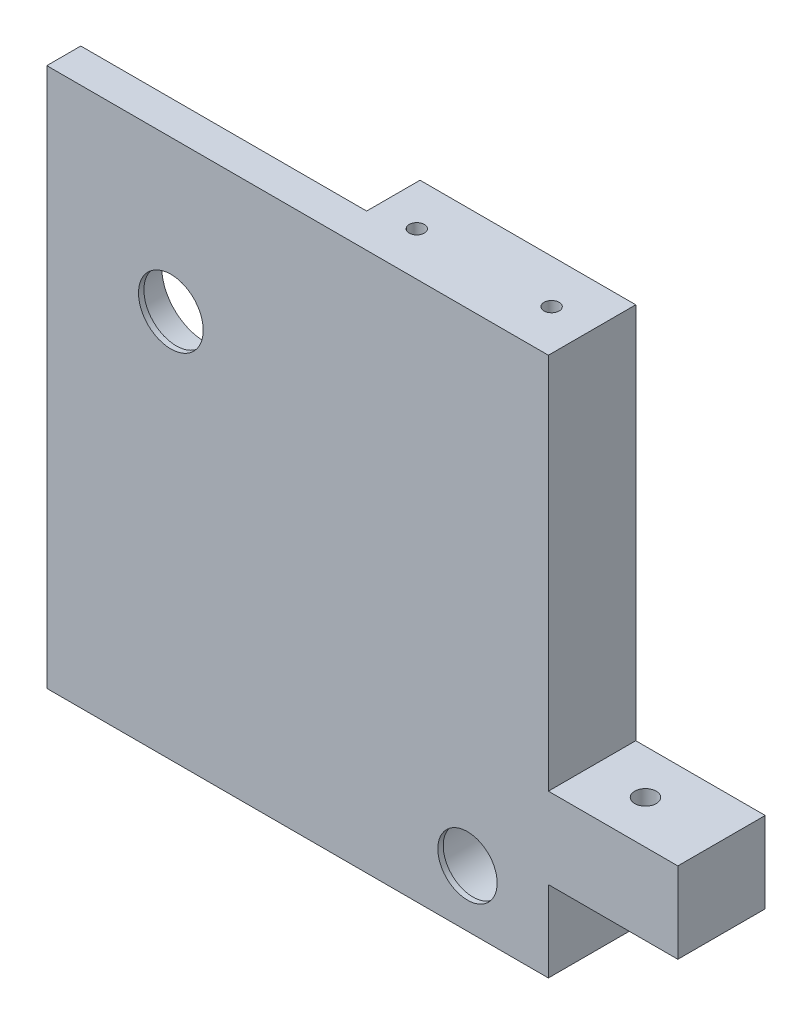
ISO-10303-21;
HEADER;
FILE_DESCRIPTION(('STEP AP214'),'2;1');
FILE_NAME('part.step','',(''),(''),'','','');
FILE_SCHEMA(('AUTOMOTIVE_DESIGN { 1 0 10303 214 1 1 1 1 }'));
ENDSEC;
DATA;
#1=APPLICATION_CONTEXT('core data for automotive mechanical design processes');
#2=APPLICATION_PROTOCOL_DEFINITION('international standard','automotive_design',2000,#1);
#3=PRODUCT_CONTEXT('',#1,'mechanical');
#4=PRODUCT('Part','Part','',(#3));
#5=PRODUCT_RELATED_PRODUCT_CATEGORY('part','',(#4));
#6=PRODUCT_DEFINITION_FORMATION('','',#4);
#7=PRODUCT_DEFINITION_CONTEXT('part definition',#1,'design');
#8=PRODUCT_DEFINITION('design','',#6,#7);
#9=PRODUCT_DEFINITION_SHAPE('','',#8);
#10=(LENGTH_UNIT() NAMED_UNIT(*) SI_UNIT(.MILLI.,.METRE.));
#11=(NAMED_UNIT(*) PLANE_ANGLE_UNIT() SI_UNIT($,.RADIAN.));
#12=(NAMED_UNIT(*) SI_UNIT($,.STERADIAN.) SOLID_ANGLE_UNIT());
#13=UNCERTAINTY_MEASURE_WITH_UNIT(LENGTH_MEASURE(1.E-05),#10,'distance_accuracy_value','');
#14=(GEOMETRIC_REPRESENTATION_CONTEXT(3) GLOBAL_UNCERTAINTY_ASSIGNED_CONTEXT((#13)) GLOBAL_UNIT_ASSIGNED_CONTEXT((#10,
#11,#12)) REPRESENTATION_CONTEXT('',''));
#15=CARTESIAN_POINT('',(0.,0.,0.));
#16=DIRECTION('',(0.,0.,1.));
#17=DIRECTION('',(1.,0.,0.));
#18=AXIS2_PLACEMENT_3D('',#15,#16,#17);
#19=CARTESIAN_POINT('',(1.81294964028777,-24.5719424460432,40.1));
#20=DIRECTION('',(0.,0.,-1.));
#21=DIRECTION('',(-1.,0.,0.));
#22=AXIS2_PLACEMENT_3D('',#19,#20,#21);
#23=CYLINDRICAL_SURFACE('',#22,7.5);
#24=CARTESIAN_POINT('',(1.81294964028777,-24.5719424460432,-9.9));
#25=DIRECTION('',(0.,0.,-1.));
#26=DIRECTION('',(-1.,0.,0.));
#27=AXIS2_PLACEMENT_3D('',#24,#25,#26);
#28=CIRCLE('',#27,7.5);
#29=CARTESIAN_POINT('',(-5.68705035971223,-24.5719424460432,-9.9));
#30=VERTEX_POINT('',#29);
#31=EDGE_CURVE('E327',#30,#30,#28,.T.);
#32=ORIENTED_EDGE('',*,*,#31,.T.);
#33=EDGE_LOOP('',(#32));
#34=FACE_BOUND('',#33,.T.);
#35=CARTESIAN_POINT('',(1.81294964028777,-24.5719424460432,5.3));
#36=DIRECTION('',(0.,0.,1.));
#37=DIRECTION('',(1.,0.,0.));
#38=AXIS2_PLACEMENT_3D('',#35,#36,#37);
#39=CIRCLE('',#38,7.5);
#40=CARTESIAN_POINT('',(9.31294964028777,-24.5719424460432,5.3));
#41=VERTEX_POINT('',#40);
#42=EDGE_CURVE('E12',#41,#41,#39,.F.);
#43=ORIENTED_EDGE('',*,*,#42,.F.);
#44=EDGE_LOOP('',(#43));
#45=FACE_BOUND('',#44,.T.);
#46=ADVANCED_FACE('F51',(#34,#45),#23,.F.);
#47=CARTESIAN_POINT('',(-53.1870503597122,36.9280575539568,50.));
#48=DIRECTION('',(0.,0.,-1.));
#49=DIRECTION('',(-1.,0.,0.));
#50=AXIS2_PLACEMENT_3D('',#47,#48,#49);
#51=CYLINDRICAL_SURFACE('',#50,8.);
#52=CARTESIAN_POINT('',(-53.1870503597122,36.9280575539568,0.));
#53=DIRECTION('',(0.,0.,-1.));
#54=DIRECTION('',(-1.,0.,0.));
#55=AXIS2_PLACEMENT_3D('',#52,#53,#54);
#56=CIRCLE('',#55,8.);
#57=CARTESIAN_POINT('',(-61.1870503597122,36.9280575539568,0.));
#58=VERTEX_POINT('',#57);
#59=EDGE_CURVE('E331',#58,#58,#56,.T.);
#60=ORIENTED_EDGE('',*,*,#59,.T.);
#61=EDGE_LOOP('',(#60));
#62=FACE_BOUND('',#61,.T.);
#63=CARTESIAN_POINT('',(-53.1870503597122,36.9280575539568,5.3));
#64=DIRECTION('',(0.,0.,1.));
#65=DIRECTION('',(1.,0.,0.));
#66=AXIS2_PLACEMENT_3D('',#63,#64,#65);
#67=CIRCLE('',#66,8.);
#68=CARTESIAN_POINT('',(-45.1870503597122,36.9280575539568,5.3));
#69=VERTEX_POINT('',#68);
#70=EDGE_CURVE('E60',#69,#69,#67,.F.);
#71=ORIENTED_EDGE('',*,*,#70,.F.);
#72=EDGE_LOOP('',(#71));
#73=FACE_BOUND('',#72,.T.);
#74=ADVANCED_FACE('F233',(#62,#73),#51,.F.);
#75=CARTESIAN_POINT('',(16.8129496402878,64.9280575539568,6.3));
#76=DIRECTION('',(1.,0.,0.));
#77=DIRECTION('',(0.,1.,0.));
#78=AXIS2_PLACEMENT_3D('',#75,#76,#77);
#79=PLANE('',#78);
#80=DIRECTION('',(0.,0.,1.));
#81=VECTOR('',#80,1.);
#82=CARTESIAN_POINT('',(16.8129496402878,-5.07194244604315,6.3));
#83=LINE('',#82,#81);
#84=CARTESIAN_POINT('',(16.8129496402878,-5.07194244604316,-9.9));
#85=VERTEX_POINT('',#84);
#86=CARTESIAN_POINT('',(16.8129496402878,-5.07194244604316,6.3));
#87=VERTEX_POINT('',#86);
#88=EDGE_CURVE('E150',#85,#87,#83,.T.);
#89=ORIENTED_EDGE('',*,*,#88,.F.);
#90=DIRECTION('',(0.,-1.,0.));
#91=VECTOR('',#90,1.);
#92=CARTESIAN_POINT('',(16.8129496402878,64.9280575539568,-9.9));
#93=LINE('',#92,#91);
#94=CARTESIAN_POINT('',(16.8129496402878,64.9280575539568,-9.9));
#95=VERTEX_POINT('',#94);
#96=EDGE_CURVE('E169',#95,#85,#93,.T.);
#97=ORIENTED_EDGE('',*,*,#96,.F.);
#98=DIRECTION('',(0.,0.,-1.));
#99=VECTOR('',#98,1.);
#100=CARTESIAN_POINT('',(16.8129496402878,64.9280575539568,6.3));
#101=LINE('',#100,#99);
#102=CARTESIAN_POINT('',(16.8129496402878,64.9280575539568,6.3));
#103=VERTEX_POINT('',#102);
#104=EDGE_CURVE('E217',#103,#95,#101,.T.);
#105=ORIENTED_EDGE('',*,*,#104,.F.);
#106=DIRECTION('',(0.,-1.,0.));
#107=VECTOR('',#106,1.);
#108=CARTESIAN_POINT('',(16.8129496402878,64.9280575539568,6.3));
#109=LINE('',#108,#107);
#110=EDGE_CURVE('E75',#103,#87,#109,.T.);
#111=ORIENTED_EDGE('',*,*,#110,.T.);
#112=EDGE_LOOP('',(#89,#97,#105,#111));
#113=FACE_BOUND('',#112,.T.);
#114=ADVANCED_FACE('F235',(#113),#79,.T.);
#115=CARTESIAN_POINT('',(0.,0.,0.));
#116=DIRECTION('',(0.,0.,1.));
#117=DIRECTION('',(1.,0.,0.));
#118=AXIS2_PLACEMENT_3D('',#115,#116,#117);
#119=PLANE('',#118);
#120=ORIENTED_EDGE('',*,*,#59,.F.);
#121=EDGE_LOOP('',(#120));
#122=FACE_BOUND('',#121,.T.);
#123=DIRECTION('',(0.,1.,0.));
#124=VECTOR('',#123,1.);
#125=CARTESIAN_POINT('',(-23.1870503597122,64.9280575539568,0.));
#126=LINE('',#125,#124);
#127=CARTESIAN_POINT('',(-23.1870503597123,-35.0719424460432,0.));
#128=VERTEX_POINT('',#127);
#129=CARTESIAN_POINT('',(-23.1870503597122,64.9280575539568,0.));
#130=VERTEX_POINT('',#129);
#131=EDGE_CURVE('E158',#128,#130,#126,.T.);
#132=ORIENTED_EDGE('',*,*,#131,.F.);
#133=DIRECTION('',(1.,0.,0.));
#134=VECTOR('',#133,1.);
#135=CARTESIAN_POINT('',(-76.1870503597122,-35.0719424460432,0.));
#136=LINE('',#135,#134);
#137=CARTESIAN_POINT('',(-76.1870503597122,-35.0719424460432,0.));
#138=VERTEX_POINT('',#137);
#139=EDGE_CURVE('E209',#138,#128,#136,.T.);
#140=ORIENTED_EDGE('',*,*,#139,.F.);
#141=DIRECTION('',(0.,-1.,0.));
#142=VECTOR('',#141,1.);
#143=CARTESIAN_POINT('',(-76.1870503597122,64.9280575539568,0.));
#144=LINE('',#143,#142);
#145=CARTESIAN_POINT('',(-76.1870503597122,64.9280575539568,0.));
#146=VERTEX_POINT('',#145);
#147=EDGE_CURVE('E191',#146,#138,#144,.T.);
#148=ORIENTED_EDGE('',*,*,#147,.F.);
#149=DIRECTION('',(1.,0.,0.));
#150=VECTOR('',#149,1.);
#151=CARTESIAN_POINT('',(-76.1870503597122,64.9280575539568,0.));
#152=LINE('',#151,#150);
#153=EDGE_CURVE('E196',#146,#130,#152,.T.);
#154=ORIENTED_EDGE('',*,*,#153,.T.);
#155=EDGE_LOOP('',(#132,#140,#148,#154));
#156=FACE_BOUND('',#155,.T.);
#157=ADVANCED_FACE('F242',(#122,#156),#119,.F.);
#158=CARTESIAN_POINT('',(-76.1870503597122,64.9280575539568,6.3));
#159=DIRECTION('',(1.,0.,0.));
#160=DIRECTION('',(0.,0.,-1.));
#161=AXIS2_PLACEMENT_3D('',#158,#159,#160);
#162=PLANE('',#161);
#163=ORIENTED_EDGE('',*,*,#147,.T.);
#164=DIRECTION('',(0.,0.,-1.));
#165=VECTOR('',#164,1.);
#166=CARTESIAN_POINT('',(-76.1870503597122,-35.0719424460432,6.3));
#167=LINE('',#166,#165);
#168=CARTESIAN_POINT('',(-76.1870503597122,-35.0719424460432,6.3));
#169=VERTEX_POINT('',#168);
#170=EDGE_CURVE('E224',#169,#138,#167,.T.);
#171=ORIENTED_EDGE('',*,*,#170,.F.);
#172=DIRECTION('',(0.,-1.,0.));
#173=VECTOR('',#172,1.);
#174=CARTESIAN_POINT('',(-76.1870503597122,64.9280575539568,6.3));
#175=LINE('',#174,#173);
#176=CARTESIAN_POINT('',(-76.1870503597122,64.9280575539568,6.3));
#177=VERTEX_POINT('',#176);
#178=EDGE_CURVE('E192',#177,#169,#175,.T.);
#179=ORIENTED_EDGE('',*,*,#178,.F.);
#180=DIRECTION('',(0.,0.,-1.));
#181=VECTOR('',#180,1.);
#182=CARTESIAN_POINT('',(-76.1870503597122,64.9280575539568,6.3));
#183=LINE('',#182,#181);
#184=EDGE_CURVE('E205',#177,#146,#183,.T.);
#185=ORIENTED_EDGE('',*,*,#184,.T.);
#186=EDGE_LOOP('',(#163,#171,#179,#185));
#187=FACE_BOUND('',#186,.T.);
#188=ADVANCED_FACE('F53',(#187),#162,.F.);
#189=CARTESIAN_POINT('',(-76.1870503597122,-35.0719424460432,6.3));
#190=DIRECTION('',(0.,1.,0.));
#191=DIRECTION('',(0.,0.,1.));
#192=AXIS2_PLACEMENT_3D('',#189,#190,#191);
#193=PLANE('',#192);
#194=ORIENTED_EDGE('',*,*,#139,.T.);
#195=DIRECTION('',(0.,0.,1.));
#196=VECTOR('',#195,1.);
#197=CARTESIAN_POINT('',(-23.1870503597123,-35.0719424460432,-9.9));
#198=LINE('',#197,#196);
#199=CARTESIAN_POINT('',(-23.1870503597123,-35.0719424460432,-9.9));
#200=VERTEX_POINT('',#199);
#201=EDGE_CURVE('E187',#200,#128,#198,.T.);
#202=ORIENTED_EDGE('',*,*,#201,.F.);
#203=DIRECTION('',(-1.,0.,0.));
#204=VECTOR('',#203,1.);
#205=CARTESIAN_POINT('',(16.8129496402877,-35.0719424460432,-9.9));
#206=LINE('',#205,#204);
#207=CARTESIAN_POINT('',(16.8129496402877,-35.0719424460432,-9.9));
#208=VERTEX_POINT('',#207);
#209=EDGE_CURVE('E173',#208,#200,#206,.T.);
#210=ORIENTED_EDGE('',*,*,#209,.F.);
#211=DIRECTION('',(0.,0.,-1.));
#212=VECTOR('',#211,1.);
#213=CARTESIAN_POINT('',(16.8129496402878,-35.0719424460432,6.3));
#214=LINE('',#213,#212);
#215=CARTESIAN_POINT('',(16.8129496402878,-35.0719424460432,6.3));
#216=VERTEX_POINT('',#215);
#217=EDGE_CURVE('E220',#216,#208,#214,.T.);
#218=ORIENTED_EDGE('',*,*,#217,.F.);
#219=DIRECTION('',(1.,0.,0.));
#220=VECTOR('',#219,1.);
#221=CARTESIAN_POINT('',(-76.1870503597122,-35.0719424460432,6.3));
#222=LINE('',#221,#220);
#223=EDGE_CURVE('E195',#169,#216,#222,.T.);
#224=ORIENTED_EDGE('',*,*,#223,.F.);
#225=ORIENTED_EDGE('',*,*,#170,.T.);
#226=EDGE_LOOP('',(#194,#202,#210,#218,#224,#225));
#227=FACE_BOUND('',#226,.T.);
#228=ADVANCED_FACE('F281',(#227),#193,.F.);
#229=DIRECTION('',(0.,0.,-1.));
#230=VECTOR('',#229,1.);
#231=CARTESIAN_POINT('',(16.8129496402878,-20.0719424460432,6.3));
#232=LINE('',#231,#230);
#233=CARTESIAN_POINT('',(16.8129496402878,-20.0719424460432,6.3));
#234=VERTEX_POINT('',#233);
#235=CARTESIAN_POINT('',(16.8129496402878,-20.0719424460432,-9.9));
#236=VERTEX_POINT('',#235);
#237=EDGE_CURVE('E67',#234,#236,#232,.T.);
#238=ORIENTED_EDGE('',*,*,#237,.F.);
#239=EDGE_CURVE('E156',#234,#216,#109,.T.);
#240=ORIENTED_EDGE('',*,*,#239,.T.);
#241=ORIENTED_EDGE('',*,*,#217,.T.);
#242=EDGE_CURVE('E163',#236,#208,#93,.T.);
#243=ORIENTED_EDGE('',*,*,#242,.F.);
#244=EDGE_LOOP('',(#238,#240,#241,#243));
#245=FACE_BOUND('',#244,.T.);
#246=ADVANCED_FACE('F244',(#245),#79,.T.);
#247=CARTESIAN_POINT('',(-76.1870503597122,64.9280575539568,6.3));
#248=DIRECTION('',(0.,1.,0.));
#249=DIRECTION('',(0.,0.,1.));
#250=AXIS2_PLACEMENT_3D('',#247,#248,#249);
#251=PLANE('',#250);
#252=CARTESIAN_POINT('',(-15.6870503597122,64.9280575539568,-1.8));
#253=DIRECTION('',(0.,1.,0.));
#254=DIRECTION('',(0.,0.,1.));
#255=AXIS2_PLACEMENT_3D('',#252,#253,#254);
#256=CIRCLE('',#255,1.4);
#257=CARTESIAN_POINT('',(-15.6870503597122,64.9280575539568,-0.400000000000003));
#258=VERTEX_POINT('',#257);
#259=EDGE_CURVE('E359',#258,#258,#256,.T.);
#260=ORIENTED_EDGE('',*,*,#259,.F.);
#261=EDGE_LOOP('',(#260));
#262=FACE_BOUND('',#261,.T.);
#263=CARTESIAN_POINT('',(9.31294964028776,64.9280575539568,-1.8));
#264=DIRECTION('',(0.,1.,0.));
#265=DIRECTION('',(0.,0.,1.));
#266=AXIS2_PLACEMENT_3D('',#263,#264,#265);
#267=CIRCLE('',#266,1.4);
#268=CARTESIAN_POINT('',(9.31294964028776,64.9280575539568,-0.400000000000003));
#269=VERTEX_POINT('',#268);
#270=EDGE_CURVE('E355',#269,#269,#267,.T.);
#271=ORIENTED_EDGE('',*,*,#270,.F.);
#272=EDGE_LOOP('',(#271));
#273=FACE_BOUND('',#272,.T.);
#274=ORIENTED_EDGE('',*,*,#153,.F.);
#275=ORIENTED_EDGE('',*,*,#184,.F.);
#276=DIRECTION('',(1.,0.,0.));
#277=VECTOR('',#276,1.);
#278=CARTESIAN_POINT('',(-76.1870503597122,64.9280575539568,6.3));
#279=LINE('',#278,#277);
#280=EDGE_CURVE('E201',#177,#103,#279,.T.);
#281=ORIENTED_EDGE('',*,*,#280,.T.);
#282=ORIENTED_EDGE('',*,*,#104,.T.);
#283=DIRECTION('',(1.,0.,0.));
#284=VECTOR('',#283,1.);
#285=CARTESIAN_POINT('',(16.8129496402878,64.9280575539568,-9.9));
#286=LINE('',#285,#284);
#287=CARTESIAN_POINT('',(-23.1870503597122,64.9280575539568,-9.9));
#288=VERTEX_POINT('',#287);
#289=EDGE_CURVE('E179',#288,#95,#286,.T.);
#290=ORIENTED_EDGE('',*,*,#289,.F.);
#291=DIRECTION('',(0.,0.,1.));
#292=VECTOR('',#291,1.);
#293=CARTESIAN_POINT('',(-23.1870503597122,64.9280575539568,-9.9));
#294=LINE('',#293,#292);
#295=EDGE_CURVE('E182',#288,#130,#294,.T.);
#296=ORIENTED_EDGE('',*,*,#295,.T.);
#297=EDGE_LOOP('',(#274,#275,#281,#282,#290,#296));
#298=FACE_BOUND('',#297,.T.);
#299=ADVANCED_FACE('F274',(#262,#273,#298),#251,.T.);
#300=CARTESIAN_POINT('',(0.,0.,6.3));
#301=DIRECTION('',(0.,0.,1.));
#302=DIRECTION('',(1.,0.,0.));
#303=AXIS2_PLACEMENT_3D('',#300,#301,#302);
#304=PLANE('',#303);
#305=ORIENTED_EDGE('',*,*,#178,.T.);
#306=ORIENTED_EDGE('',*,*,#223,.T.);
#307=ORIENTED_EDGE('',*,*,#239,.F.);
#308=DIRECTION('',(-1.,0.,0.));
#309=VECTOR('',#308,1.);
#310=CARTESIAN_POINT('',(40.8129496402878,-20.0719424460432,6.3));
#311=LINE('',#310,#309);
#312=CARTESIAN_POINT('',(40.8129496402878,-20.0719424460432,6.3));
#313=VERTEX_POINT('',#312);
#314=EDGE_CURVE('E133',#313,#234,#311,.T.);
#315=ORIENTED_EDGE('',*,*,#314,.F.);
#316=DIRECTION('',(0.,-1.,0.));
#317=VECTOR('',#316,1.);
#318=CARTESIAN_POINT('',(40.8129496402878,-5.07194244604315,6.3));
#319=LINE('',#318,#317);
#320=CARTESIAN_POINT('',(40.8129496402878,-5.07194244604315,6.3));
#321=VERTEX_POINT('',#320);
#322=EDGE_CURVE('E140',#321,#313,#319,.T.);
#323=ORIENTED_EDGE('',*,*,#322,.F.);
#324=DIRECTION('',(-1.,0.,0.));
#325=VECTOR('',#324,1.);
#326=CARTESIAN_POINT('',(40.8129496402878,-5.07194244604315,6.3));
#327=LINE('',#326,#325);
#328=EDGE_CURVE('E304',#321,#87,#327,.T.);
#329=ORIENTED_EDGE('',*,*,#328,.T.);
#330=ORIENTED_EDGE('',*,*,#110,.F.);
#331=ORIENTED_EDGE('',*,*,#280,.F.);
#332=EDGE_LOOP('',(#305,#306,#307,#315,#323,#329,#330,#331));
#333=FACE_BOUND('',#332,.T.);
#334=CARTESIAN_POINT('',(-53.1870503597122,36.9280575539568,6.3));
#335=DIRECTION('',(0.,0.,1.));
#336=DIRECTION('',(1.,0.,0.));
#337=AXIS2_PLACEMENT_3D('',#334,#335,#336);
#338=CIRCLE('',#337,6.);
#339=CARTESIAN_POINT('',(-47.1870503597122,36.9280575539568,6.3));
#340=VERTEX_POINT('',#339);
#341=EDGE_CURVE('E335',#340,#340,#338,.T.);
#342=ORIENTED_EDGE('',*,*,#341,.F.);
#343=EDGE_LOOP('',(#342));
#344=FACE_BOUND('',#343,.T.);
#345=CARTESIAN_POINT('',(1.81294964028777,-24.5719424460432,6.3));
#346=DIRECTION('',(0.,0.,1.));
#347=DIRECTION('',(1.,0.,0.));
#348=AXIS2_PLACEMENT_3D('',#345,#346,#347);
#349=CIRCLE('',#348,5.5);
#350=CARTESIAN_POINT('',(7.31294964028777,-24.5719424460432,6.3));
#351=VERTEX_POINT('',#350);
#352=EDGE_CURVE('E343',#351,#351,#349,.T.);
#353=ORIENTED_EDGE('',*,*,#352,.F.);
#354=EDGE_LOOP('',(#353));
#355=FACE_BOUND('',#354,.T.);
#356=ADVANCED_FACE('F153',(#333,#344,#355),#304,.T.);
#357=CARTESIAN_POINT('',(-23.1870503597122,64.9280575539568,-9.9));
#358=DIRECTION('',(1.,0.,0.));
#359=DIRECTION('',(0.,1.,0.));
#360=AXIS2_PLACEMENT_3D('',#357,#358,#359);
#361=PLANE('',#360);
#362=ORIENTED_EDGE('',*,*,#131,.T.);
#363=ORIENTED_EDGE('',*,*,#295,.F.);
#364=DIRECTION('',(0.,1.,0.));
#365=VECTOR('',#364,1.);
#366=CARTESIAN_POINT('',(-23.1870503597122,64.9280575539568,-9.9));
#367=LINE('',#366,#365);
#368=EDGE_CURVE('E176',#200,#288,#367,.T.);
#369=ORIENTED_EDGE('',*,*,#368,.F.);
#370=ORIENTED_EDGE('',*,*,#201,.T.);
#371=EDGE_LOOP('',(#362,#363,#369,#370));
#372=FACE_BOUND('',#371,.T.);
#373=ADVANCED_FACE('F267',(#372),#361,.F.);
#374=CARTESIAN_POINT('',(0.,0.,-9.9));
#375=DIRECTION('',(0.,0.,-1.));
#376=DIRECTION('',(-1.,0.,0.));
#377=AXIS2_PLACEMENT_3D('',#374,#375,#376);
#378=PLANE('',#377);
#379=ORIENTED_EDGE('',*,*,#31,.F.);
#380=EDGE_LOOP('',(#379));
#381=FACE_BOUND('',#380,.T.);
#382=ORIENTED_EDGE('',*,*,#96,.T.);
#383=DIRECTION('',(-1.,0.,0.));
#384=VECTOR('',#383,1.);
#385=CARTESIAN_POINT('',(40.8129496402878,-5.07194244604315,-9.9));
#386=LINE('',#385,#384);
#387=CARTESIAN_POINT('',(40.8129496402878,-5.07194244604315,-9.9));
#388=VERTEX_POINT('',#387);
#389=EDGE_CURVE('E165',#388,#85,#386,.T.);
#390=ORIENTED_EDGE('',*,*,#389,.F.);
#391=DIRECTION('',(0.,1.,0.));
#392=VECTOR('',#391,1.);
#393=CARTESIAN_POINT('',(40.8129496402878,-5.07194244604315,-9.9));
#394=LINE('',#393,#392);
#395=CARTESIAN_POINT('',(40.8129496402878,-20.0719424460432,-9.9));
#396=VERTEX_POINT('',#395);
#397=EDGE_CURVE('E139',#396,#388,#394,.T.);
#398=ORIENTED_EDGE('',*,*,#397,.F.);
#399=DIRECTION('',(-1.,0.,0.));
#400=VECTOR('',#399,1.);
#401=CARTESIAN_POINT('',(40.8129496402878,-20.0719424460432,-9.9));
#402=LINE('',#401,#400);
#403=EDGE_CURVE('E135',#396,#236,#402,.T.);
#404=ORIENTED_EDGE('',*,*,#403,.T.);
#405=ORIENTED_EDGE('',*,*,#242,.T.);
#406=ORIENTED_EDGE('',*,*,#209,.T.);
#407=ORIENTED_EDGE('',*,*,#368,.T.);
#408=ORIENTED_EDGE('',*,*,#289,.T.);
#409=EDGE_LOOP('',(#382,#390,#398,#404,#405,#406,#407,#408));
#410=FACE_BOUND('',#409,.T.);
#411=ADVANCED_FACE('F263',(#381,#410),#378,.T.);
#412=CARTESIAN_POINT('',(40.8129496402878,-20.0719424460432,6.3));
#413=DIRECTION('',(0.,1.,0.));
#414=DIRECTION('',(-1.,0.,0.));
#415=AXIS2_PLACEMENT_3D('',#412,#413,#414);
#416=PLANE('',#415);
#417=CARTESIAN_POINT('',(26.8129496402877,-20.0719424460432,-1.7));
#418=DIRECTION('',(0.,1.,0.));
#419=DIRECTION('',(-1.,0.,0.));
#420=AXIS2_PLACEMENT_3D('',#417,#418,#419);
#421=CIRCLE('',#420,2.);
#422=CARTESIAN_POINT('',(24.8129496402878,-20.0719424460432,-1.7));
#423=VERTEX_POINT('',#422);
#424=EDGE_CURVE('E316',#423,#423,#421,.T.);
#425=ORIENTED_EDGE('',*,*,#424,.T.);
#426=EDGE_LOOP('',(#425));
#427=FACE_BOUND('',#426,.T.);
#428=ORIENTED_EDGE('',*,*,#237,.T.);
#429=ORIENTED_EDGE('',*,*,#403,.F.);
#430=DIRECTION('',(0.,0.,-1.));
#431=VECTOR('',#430,1.);
#432=CARTESIAN_POINT('',(40.8129496402878,-20.0719424460432,6.3));
#433=LINE('',#432,#431);
#434=EDGE_CURVE('E129',#313,#396,#433,.T.);
#435=ORIENTED_EDGE('',*,*,#434,.F.);
#436=ORIENTED_EDGE('',*,*,#314,.T.);
#437=EDGE_LOOP('',(#428,#429,#435,#436));
#438=FACE_BOUND('',#437,.T.);
#439=ADVANCED_FACE('F131',(#427,#438),#416,.F.);
#440=CARTESIAN_POINT('',(40.8129496402878,-5.07194244604315,6.3));
#441=DIRECTION('',(0.,-1.,0.));
#442=DIRECTION('',(1.,0.,0.));
#443=AXIS2_PLACEMENT_3D('',#440,#441,#442);
#444=PLANE('',#443);
#445=CARTESIAN_POINT('',(26.8129496402877,-5.07194244604315,-1.7));
#446=DIRECTION('',(0.,1.,0.));
#447=DIRECTION('',(-1.,0.,0.));
#448=AXIS2_PLACEMENT_3D('',#445,#446,#447);
#449=CIRCLE('',#448,2.);
#450=CARTESIAN_POINT('',(24.8129496402878,-5.07194244604315,-1.7));
#451=VERTEX_POINT('',#450);
#452=EDGE_CURVE('E323',#451,#451,#449,.T.);
#453=ORIENTED_EDGE('',*,*,#452,.F.);
#454=EDGE_LOOP('',(#453));
#455=FACE_BOUND('',#454,.T.);
#456=ORIENTED_EDGE('',*,*,#88,.T.);
#457=ORIENTED_EDGE('',*,*,#328,.F.);
#458=DIRECTION('',(0.,0.,1.));
#459=VECTOR('',#458,1.);
#460=CARTESIAN_POINT('',(40.8129496402878,-5.07194244604315,6.3));
#461=LINE('',#460,#459);
#462=EDGE_CURVE('E145',#388,#321,#461,.T.);
#463=ORIENTED_EDGE('',*,*,#462,.F.);
#464=ORIENTED_EDGE('',*,*,#389,.T.);
#465=EDGE_LOOP('',(#456,#457,#463,#464));
#466=FACE_BOUND('',#465,.T.);
#467=ADVANCED_FACE('F257',(#455,#466),#444,.F.);
#468=CARTESIAN_POINT('',(40.8129496402878,0.,0.));
#469=DIRECTION('',(1.,0.,0.));
#470=DIRECTION('',(0.,0.,-1.));
#471=AXIS2_PLACEMENT_3D('',#468,#469,#470);
#472=PLANE('',#471);
#473=ORIENTED_EDGE('',*,*,#322,.T.);
#474=ORIENTED_EDGE('',*,*,#434,.T.);
#475=ORIENTED_EDGE('',*,*,#397,.T.);
#476=ORIENTED_EDGE('',*,*,#462,.T.);
#477=EDGE_LOOP('',(#473,#474,#475,#476));
#478=FACE_BOUND('',#477,.T.);
#479=ADVANCED_FACE('F143',(#478),#472,.T.);
#480=CARTESIAN_POINT('',(26.8129496402878,-55.0719424460432,-1.7));
#481=DIRECTION('',(0.,1.,0.));
#482=DIRECTION('',(-1.,0.,0.));
#483=AXIS2_PLACEMENT_3D('',#480,#481,#482);
#484=CYLINDRICAL_SURFACE('',#483,2.);
#485=ORIENTED_EDGE('',*,*,#452,.T.);
#486=EDGE_LOOP('',(#485));
#487=FACE_BOUND('',#486,.T.);
#488=ORIENTED_EDGE('',*,*,#424,.F.);
#489=EDGE_LOOP('',(#488));
#490=FACE_BOUND('',#489,.T.);
#491=ADVANCED_FACE('F251',(#487,#490),#484,.F.);
#492=CARTESIAN_POINT('',(-53.1870503597122,36.9280575539568,5.3));
#493=DIRECTION('',(0.,0.,1.));
#494=DIRECTION('',(1.,0.,0.));
#495=AXIS2_PLACEMENT_3D('',#492,#493,#494);
#496=PLANE('',#495);
#497=CARTESIAN_POINT('',(-53.1870503597122,36.9280575539568,5.3));
#498=DIRECTION('',(0.,0.,1.));
#499=DIRECTION('',(1.,0.,0.));
#500=AXIS2_PLACEMENT_3D('',#497,#498,#499);
#501=CIRCLE('',#500,6.);
#502=CARTESIAN_POINT('',(-47.1870503597122,36.9280575539568,5.3));
#503=VERTEX_POINT('',#502);
#504=EDGE_CURVE('E334',#503,#503,#501,.T.);
#505=ORIENTED_EDGE('',*,*,#504,.T.);
#506=EDGE_LOOP('',(#505));
#507=FACE_BOUND('',#506,.T.);
#508=ORIENTED_EDGE('',*,*,#70,.T.);
#509=EDGE_LOOP('',(#508));
#510=FACE_BOUND('',#509,.T.);
#511=ADVANCED_FACE('F231',(#507,#510),#496,.F.);
#512=CARTESIAN_POINT('',(-53.1870503597122,36.9280575539568,5.3));
#513=DIRECTION('',(0.,0.,1.));
#514=DIRECTION('',(1.,0.,0.));
#515=AXIS2_PLACEMENT_3D('',#512,#513,#514);
#516=CYLINDRICAL_SURFACE('',#515,6.);
#517=ORIENTED_EDGE('',*,*,#504,.F.);
#518=EDGE_LOOP('',(#517));
#519=FACE_BOUND('',#518,.T.);
#520=ORIENTED_EDGE('',*,*,#341,.T.);
#521=EDGE_LOOP('',(#520));
#522=FACE_BOUND('',#521,.T.);
#523=ADVANCED_FACE('F396',(#519,#522),#516,.F.);
#524=CARTESIAN_POINT('',(1.81294964028777,-24.5719424460432,5.3));
#525=DIRECTION('',(0.,0.,1.));
#526=DIRECTION('',(1.,0.,0.));
#527=AXIS2_PLACEMENT_3D('',#524,#525,#526);
#528=PLANE('',#527);
#529=CARTESIAN_POINT('',(1.81294964028777,-24.5719424460432,5.3));
#530=DIRECTION('',(0.,0.,1.));
#531=DIRECTION('',(1.,0.,0.));
#532=AXIS2_PLACEMENT_3D('',#529,#530,#531);
#533=CIRCLE('',#532,5.5);
#534=CARTESIAN_POINT('',(7.31294964028777,-24.5719424460432,5.3));
#535=VERTEX_POINT('',#534);
#536=EDGE_CURVE('E339',#535,#535,#533,.T.);
#537=ORIENTED_EDGE('',*,*,#536,.T.);
#538=EDGE_LOOP('',(#537));
#539=FACE_BOUND('',#538,.T.);
#540=ORIENTED_EDGE('',*,*,#42,.T.);
#541=EDGE_LOOP('',(#540));
#542=FACE_BOUND('',#541,.T.);
#543=ADVANCED_FACE('F389',(#539,#542),#528,.F.);
#544=CARTESIAN_POINT('',(1.81294964028777,-24.5719424460432,5.3));
#545=DIRECTION('',(0.,0.,1.));
#546=DIRECTION('',(1.,0.,0.));
#547=AXIS2_PLACEMENT_3D('',#544,#545,#546);
#548=CYLINDRICAL_SURFACE('',#547,5.5);
#549=ORIENTED_EDGE('',*,*,#536,.F.);
#550=EDGE_LOOP('',(#549));
#551=FACE_BOUND('',#550,.T.);
#552=ORIENTED_EDGE('',*,*,#352,.T.);
#553=EDGE_LOOP('',(#552));
#554=FACE_BOUND('',#553,.T.);
#555=ADVANCED_FACE('F380',(#551,#554),#548,.F.);
#556=CARTESIAN_POINT('',(9.31294964028776,44.9280575539568,-1.8));
#557=DIRECTION('',(0.,1.,0.));
#558=DIRECTION('',(0.,0.,1.));
#559=AXIS2_PLACEMENT_3D('',#556,#557,#558);
#560=CYLINDRICAL_SURFACE('',#559,1.4);
#561=CARTESIAN_POINT('',(9.31294964028776,44.9280575539568,-1.8));
#562=DIRECTION('',(0.,1.,0.));
#563=DIRECTION('',(0.,0.,1.));
#564=AXIS2_PLACEMENT_3D('',#561,#562,#563);
#565=CIRCLE('',#564,1.4);
#566=CARTESIAN_POINT('',(9.31294964028776,44.9280575539568,-0.400000000000003));
#567=VERTEX_POINT('',#566);
#568=EDGE_CURVE('E351',#567,#567,#565,.T.);
#569=ORIENTED_EDGE('',*,*,#568,.F.);
#570=EDGE_LOOP('',(#569));
#571=FACE_BOUND('',#570,.T.);
#572=ORIENTED_EDGE('',*,*,#270,.T.);
#573=EDGE_LOOP('',(#572));
#574=FACE_BOUND('',#573,.T.);
#575=ADVANCED_FACE('F378',(#571,#574),#560,.F.);
#576=CARTESIAN_POINT('',(9.31294964028776,44.9280575539568,-1.8));
#577=DIRECTION('',(0.,1.,0.));
#578=DIRECTION('',(0.,0.,1.));
#579=AXIS2_PLACEMENT_3D('',#576,#577,#578);
#580=PLANE('',#579);
#581=ORIENTED_EDGE('',*,*,#568,.T.);
#582=EDGE_LOOP('',(#581));
#583=FACE_BOUND('',#582,.T.);
#584=ADVANCED_FACE('F372',(#583),#580,.T.);
#585=CARTESIAN_POINT('',(-15.6870503597122,44.9280575539568,-1.8));
#586=DIRECTION('',(0.,1.,0.));
#587=DIRECTION('',(0.,0.,1.));
#588=AXIS2_PLACEMENT_3D('',#585,#586,#587);
#589=CYLINDRICAL_SURFACE('',#588,1.4);
#590=CARTESIAN_POINT('',(-15.6870503597122,44.9280575539568,-1.8));
#591=DIRECTION('',(0.,1.,0.));
#592=DIRECTION('',(0.,0.,1.));
#593=AXIS2_PLACEMENT_3D('',#590,#591,#592);
#594=CIRCLE('',#593,1.4);
#595=CARTESIAN_POINT('',(-15.6870503597122,44.9280575539568,-0.400000000000003));
#596=VERTEX_POINT('',#595);
#597=EDGE_CURVE('E347',#596,#596,#594,.T.);
#598=ORIENTED_EDGE('',*,*,#597,.F.);
#599=EDGE_LOOP('',(#598));
#600=FACE_BOUND('',#599,.T.);
#601=ORIENTED_EDGE('',*,*,#259,.T.);
#602=EDGE_LOOP('',(#601));
#603=FACE_BOUND('',#602,.T.);
#604=ADVANCED_FACE('F369',(#600,#603),#589,.F.);
#605=CARTESIAN_POINT('',(0.,44.9280575539568,0.));
#606=DIRECTION('',(0.,1.,0.));
#607=DIRECTION('',(0.,0.,1.));
#608=AXIS2_PLACEMENT_3D('',#605,#606,#607);
#609=PLANE('',#608);
#610=ORIENTED_EDGE('',*,*,#597,.T.);
#611=EDGE_LOOP('',(#610));
#612=FACE_BOUND('',#611,.T.);
#613=ADVANCED_FACE('F367',(#612),#609,.T.);
#614=CLOSED_SHELL('',(#46,#74,#114,#157,#188,#228,#246,#299,#356,#373,#411,#439,#467,#479,#491,
#511,#523,#543,#555,#575,#584,#604,#613));
#615=MANIFOLD_SOLID_BREP('B2',#614);
#616=ADVANCED_BREP_SHAPE_REPRESENTATION('',(#18,#615),#14);
#617=SHAPE_DEFINITION_REPRESENTATION(#9,#616);
ENDSEC;
END-ISO-10303-21;
